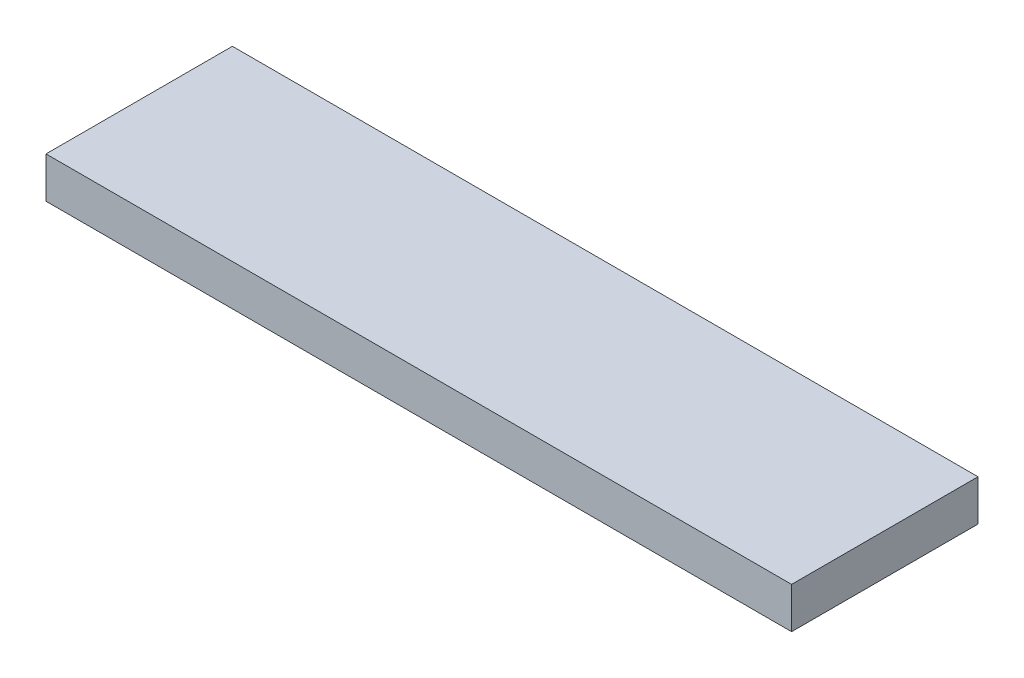
ISO-10303-21;
HEADER;
FILE_DESCRIPTION(('STEP AP214'),'2;1');
FILE_NAME('part.step','',(''),(''),'','','');
FILE_SCHEMA(('AUTOMOTIVE_DESIGN { 1 0 10303 214 1 1 1 1 }'));
ENDSEC;
DATA;
#1=APPLICATION_CONTEXT('core data for automotive mechanical design processes');
#2=APPLICATION_PROTOCOL_DEFINITION('international standard','automotive_design',2000,#1);
#3=PRODUCT_CONTEXT('',#1,'mechanical');
#4=PRODUCT('Part','Part','',(#3));
#5=PRODUCT_RELATED_PRODUCT_CATEGORY('part','',(#4));
#6=PRODUCT_DEFINITION_FORMATION('','',#4);
#7=PRODUCT_DEFINITION_CONTEXT('part definition',#1,'design');
#8=PRODUCT_DEFINITION('design','',#6,#7);
#9=PRODUCT_DEFINITION_SHAPE('','',#8);
#10=(LENGTH_UNIT() NAMED_UNIT(*) SI_UNIT(.MILLI.,.METRE.));
#11=(NAMED_UNIT(*) PLANE_ANGLE_UNIT() SI_UNIT($,.RADIAN.));
#12=(NAMED_UNIT(*) SI_UNIT($,.STERADIAN.) SOLID_ANGLE_UNIT());
#13=UNCERTAINTY_MEASURE_WITH_UNIT(LENGTH_MEASURE(1.E-05),#10,'distance_accuracy_value','');
#14=(GEOMETRIC_REPRESENTATION_CONTEXT(3) GLOBAL_UNCERTAINTY_ASSIGNED_CONTEXT((#13)) GLOBAL_UNIT_ASSIGNED_CONTEXT((#10,
#11,#12)) REPRESENTATION_CONTEXT('',''));
#15=CARTESIAN_POINT('',(0.,0.,0.));
#16=DIRECTION('',(0.,0.,1.));
#17=DIRECTION('',(1.,0.,0.));
#18=AXIS2_PLACEMENT_3D('',#15,#16,#17);
#19=CARTESIAN_POINT('',(500.,55.,125.));
#20=DIRECTION('',(-1.,0.,0.));
#21=DIRECTION('',(0.,0.,1.));
#22=AXIS2_PLACEMENT_3D('',#19,#20,#21);
#23=PLANE('',#22);
#24=DIRECTION('',(0.,0.,-1.));
#25=VECTOR('',#24,1.);
#26=CARTESIAN_POINT('',(500.,0.,125.));
#27=LINE('',#26,#25);
#28=CARTESIAN_POINT('',(500.,0.,125.));
#29=VERTEX_POINT('',#28);
#30=CARTESIAN_POINT('',(500.,0.,-125.));
#31=VERTEX_POINT('',#30);
#32=EDGE_CURVE('E103',#29,#31,#27,.T.);
#33=ORIENTED_EDGE('',*,*,#32,.T.);
#34=DIRECTION('',(0.,-1.,0.));
#35=VECTOR('',#34,1.);
#36=CARTESIAN_POINT('',(500.,55.,-125.));
#37=LINE('',#36,#35);
#38=CARTESIAN_POINT('',(500.,55.,-125.));
#39=VERTEX_POINT('',#38);
#40=EDGE_CURVE('E11',#39,#31,#37,.T.);
#41=ORIENTED_EDGE('',*,*,#40,.F.);
#42=DIRECTION('',(0.,0.,-1.));
#43=VECTOR('',#42,1.);
#44=CARTESIAN_POINT('',(500.,55.,125.));
#45=LINE('',#44,#43);
#46=CARTESIAN_POINT('',(500.,55.,125.));
#47=VERTEX_POINT('',#46);
#48=EDGE_CURVE('E91',#47,#39,#45,.T.);
#49=ORIENTED_EDGE('',*,*,#48,.F.);
#50=DIRECTION('',(0.,-1.,0.));
#51=VECTOR('',#50,1.);
#52=CARTESIAN_POINT('',(500.,55.,125.));
#53=LINE('',#52,#51);
#54=EDGE_CURVE('E99',#47,#29,#53,.T.);
#55=ORIENTED_EDGE('',*,*,#54,.T.);
#56=EDGE_LOOP('',(#33,#41,#49,#55));
#57=FACE_BOUND('',#56,.T.);
#58=ADVANCED_FACE('F40',(#57),#23,.F.);
#59=CARTESIAN_POINT('',(-500.,55.,-125.));
#60=DIRECTION('',(0.,0.,1.));
#61=DIRECTION('',(1.,0.,0.));
#62=AXIS2_PLACEMENT_3D('',#59,#60,#61);
#63=PLANE('',#62);
#64=DIRECTION('',(-1.,0.,0.));
#65=VECTOR('',#64,1.);
#66=CARTESIAN_POINT('',(-500.,0.,-125.));
#67=LINE('',#66,#65);
#68=CARTESIAN_POINT('',(-500.,0.,-125.));
#69=VERTEX_POINT('',#68);
#70=EDGE_CURVE('E95',#31,#69,#67,.T.);
#71=ORIENTED_EDGE('',*,*,#70,.T.);
#72=DIRECTION('',(0.,-1.,0.));
#73=VECTOR('',#72,1.);
#74=CARTESIAN_POINT('',(-500.,55.,-125.));
#75=LINE('',#74,#73);
#76=CARTESIAN_POINT('',(-500.,55.,-125.));
#77=VERTEX_POINT('',#76);
#78=EDGE_CURVE('E48',#77,#69,#75,.T.);
#79=ORIENTED_EDGE('',*,*,#78,.F.);
#80=DIRECTION('',(-1.,0.,0.));
#81=VECTOR('',#80,1.);
#82=CARTESIAN_POINT('',(-500.,55.,-125.));
#83=LINE('',#82,#81);
#84=EDGE_CURVE('E86',#39,#77,#83,.T.);
#85=ORIENTED_EDGE('',*,*,#84,.F.);
#86=ORIENTED_EDGE('',*,*,#40,.T.);
#87=EDGE_LOOP('',(#71,#79,#85,#86));
#88=FACE_BOUND('',#87,.T.);
#89=ADVANCED_FACE('F94',(#88),#63,.F.);
#90=CARTESIAN_POINT('',(-500.,55.,125.));
#91=DIRECTION('',(1.,0.,0.));
#92=DIRECTION('',(0.,0.,-1.));
#93=AXIS2_PLACEMENT_3D('',#90,#91,#92);
#94=PLANE('',#93);
#95=DIRECTION('',(0.,0.,1.));
#96=VECTOR('',#95,1.);
#97=CARTESIAN_POINT('',(-500.,0.,125.));
#98=LINE('',#97,#96);
#99=CARTESIAN_POINT('',(-500.,0.,125.));
#100=VERTEX_POINT('',#99);
#101=EDGE_CURVE('E73',#69,#100,#98,.T.);
#102=ORIENTED_EDGE('',*,*,#101,.T.);
#103=DIRECTION('',(0.,-1.,0.));
#104=VECTOR('',#103,1.);
#105=CARTESIAN_POINT('',(-500.,55.,125.));
#106=LINE('',#105,#104);
#107=CARTESIAN_POINT('',(-500.,55.,125.));
#108=VERTEX_POINT('',#107);
#109=EDGE_CURVE('E96',#108,#100,#106,.T.);
#110=ORIENTED_EDGE('',*,*,#109,.F.);
#111=DIRECTION('',(0.,0.,1.));
#112=VECTOR('',#111,1.);
#113=CARTESIAN_POINT('',(-500.,55.,125.));
#114=LINE('',#113,#112);
#115=EDGE_CURVE('E89',#77,#108,#114,.T.);
#116=ORIENTED_EDGE('',*,*,#115,.F.);
#117=ORIENTED_EDGE('',*,*,#78,.T.);
#118=EDGE_LOOP('',(#102,#110,#116,#117));
#119=FACE_BOUND('',#118,.T.);
#120=ADVANCED_FACE('F97',(#119),#94,.F.);
#121=CARTESIAN_POINT('',(-500.,55.,125.));
#122=DIRECTION('',(0.,0.,-1.));
#123=DIRECTION('',(-1.,0.,0.));
#124=AXIS2_PLACEMENT_3D('',#121,#122,#123);
#125=PLANE('',#124);
#126=DIRECTION('',(1.,0.,0.));
#127=VECTOR('',#126,1.);
#128=CARTESIAN_POINT('',(-500.,0.,125.));
#129=LINE('',#128,#127);
#130=EDGE_CURVE('E79',#100,#29,#129,.T.);
#131=ORIENTED_EDGE('',*,*,#130,.T.);
#132=ORIENTED_EDGE('',*,*,#54,.F.);
#133=DIRECTION('',(1.,0.,0.));
#134=VECTOR('',#133,1.);
#135=CARTESIAN_POINT('',(-500.,55.,125.));
#136=LINE('',#135,#134);
#137=EDGE_CURVE('E56',#108,#47,#136,.T.);
#138=ORIENTED_EDGE('',*,*,#137,.F.);
#139=ORIENTED_EDGE('',*,*,#109,.T.);
#140=EDGE_LOOP('',(#131,#132,#138,#139));
#141=FACE_BOUND('',#140,.T.);
#142=ADVANCED_FACE('F110',(#141),#125,.F.);
#143=CARTESIAN_POINT('',(0.,55.,0.));
#144=DIRECTION('',(0.,-1.,0.));
#145=DIRECTION('',(0.,0.,-1.));
#146=AXIS2_PLACEMENT_3D('',#143,#144,#145);
#147=PLANE('',#146);
#148=ORIENTED_EDGE('',*,*,#48,.T.);
#149=ORIENTED_EDGE('',*,*,#84,.T.);
#150=ORIENTED_EDGE('',*,*,#115,.T.);
#151=ORIENTED_EDGE('',*,*,#137,.T.);
#152=EDGE_LOOP('',(#148,#149,#150,#151));
#153=FACE_BOUND('',#152,.T.);
#154=ADVANCED_FACE('F87',(#153),#147,.F.);
#155=CARTESIAN_POINT('',(0.,0.,0.));
#156=DIRECTION('',(0.,-1.,0.));
#157=DIRECTION('',(0.,0.,-1.));
#158=AXIS2_PLACEMENT_3D('',#155,#156,#157);
#159=PLANE('',#158);
#160=ORIENTED_EDGE('',*,*,#32,.F.);
#161=ORIENTED_EDGE('',*,*,#130,.F.);
#162=ORIENTED_EDGE('',*,*,#101,.F.);
#163=ORIENTED_EDGE('',*,*,#70,.F.);
#164=EDGE_LOOP('',(#160,#161,#162,#163));
#165=FACE_BOUND('',#164,.T.);
#166=ADVANCED_FACE('F113',(#165),#159,.T.);
#167=CLOSED_SHELL('',(#58,#89,#120,#142,#154,#166));
#168=MANIFOLD_SOLID_BREP('B2',#167);
#169=ADVANCED_BREP_SHAPE_REPRESENTATION('',(#18,#168),#14);
#170=SHAPE_DEFINITION_REPRESENTATION(#9,#169);
ENDSEC;
END-ISO-10303-21;
